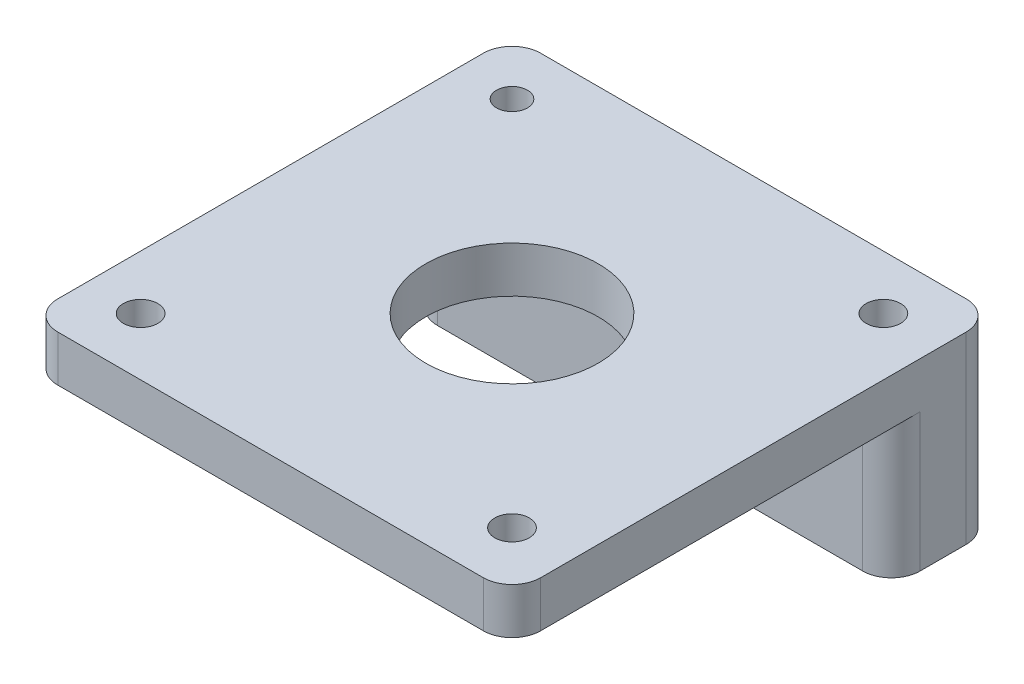
ISO-10303-21;
HEADER;
FILE_DESCRIPTION(('STEP AP214'),'2;1');
FILE_NAME('part.step','',(''),(''),'','','');
FILE_SCHEMA(('AUTOMOTIVE_DESIGN { 1 0 10303 214 1 1 1 1 }'));
ENDSEC;
DATA;
#1=APPLICATION_CONTEXT('core data for automotive mechanical design processes');
#2=APPLICATION_PROTOCOL_DEFINITION('international standard','automotive_design',2000,#1);
#3=PRODUCT_CONTEXT('',#1,'mechanical');
#4=PRODUCT('Part','Part','',(#3));
#5=PRODUCT_RELATED_PRODUCT_CATEGORY('part','',(#4));
#6=PRODUCT_DEFINITION_FORMATION('','',#4);
#7=PRODUCT_DEFINITION_CONTEXT('part definition',#1,'design');
#8=PRODUCT_DEFINITION('design','',#6,#7);
#9=PRODUCT_DEFINITION_SHAPE('','',#8);
#10=(LENGTH_UNIT() NAMED_UNIT(*) SI_UNIT(.MILLI.,.METRE.));
#11=(NAMED_UNIT(*) PLANE_ANGLE_UNIT() SI_UNIT($,.RADIAN.));
#12=(NAMED_UNIT(*) SI_UNIT($,.STERADIAN.) SOLID_ANGLE_UNIT());
#13=UNCERTAINTY_MEASURE_WITH_UNIT(LENGTH_MEASURE(1.E-05),#10,'distance_accuracy_value','');
#14=(GEOMETRIC_REPRESENTATION_CONTEXT(3) GLOBAL_UNCERTAINTY_ASSIGNED_CONTEXT((#13)) GLOBAL_UNIT_ASSIGNED_CONTEXT((#10,
#11,#12)) REPRESENTATION_CONTEXT('',''));
#15=CARTESIAN_POINT('',(0.,0.,0.));
#16=DIRECTION('',(0.,0.,1.));
#17=DIRECTION('',(1.,0.,0.));
#18=AXIS2_PLACEMENT_3D('',#15,#16,#17);
#19=CARTESIAN_POINT('',(37.,-4.,-4.29999999999951));
#20=DIRECTION('',(0.,1.,0.));
#21=DIRECTION('',(0.,0.,1.));
#22=AXIS2_PLACEMENT_3D('',#19,#20,#21);
#23=CYLINDRICAL_SURFACE('',#22,1.5);
#24=CARTESIAN_POINT('',(37.,16.,-4.29999999999951));
#25=DIRECTION('',(0.,1.,0.));
#26=DIRECTION('',(0.,0.,1.));
#27=AXIS2_PLACEMENT_3D('',#24,#25,#26);
#28=CIRCLE('',#27,1.5);
#29=CARTESIAN_POINT('',(37.,16.,-2.79999999999951));
#30=VERTEX_POINT('',#29);
#31=EDGE_CURVE('E230',#30,#30,#28,.T.);
#32=ORIENTED_EDGE('',*,*,#31,.T.);
#33=EDGE_LOOP('',(#32));
#34=FACE_BOUND('',#33,.T.);
#35=CARTESIAN_POINT('',(37.,5.,-4.29999999999951));
#36=DIRECTION('',(0.,-1.,0.));
#37=DIRECTION('',(0.,0.,-1.));
#38=AXIS2_PLACEMENT_3D('',#35,#36,#37);
#39=CIRCLE('',#38,1.5);
#40=CARTESIAN_POINT('',(37.,5.,-5.7999999999995));
#41=VERTEX_POINT('',#40);
#42=EDGE_CURVE('E37',#41,#41,#39,.F.);
#43=ORIENTED_EDGE('',*,*,#42,.F.);
#44=EDGE_LOOP('',(#43));
#45=FACE_BOUND('',#44,.T.);
#46=ADVANCED_FACE('F33',(#34,#45),#23,.F.);
#47=CARTESIAN_POINT('',(4.7,-4.,-4.29999999999994));
#48=DIRECTION('',(0.,1.,0.));
#49=DIRECTION('',(0.,0.,1.));
#50=AXIS2_PLACEMENT_3D('',#47,#48,#49);
#51=CYLINDRICAL_SURFACE('',#50,1.34225206482077);
#52=CARTESIAN_POINT('',(4.7,16.,-4.29999999999994));
#53=DIRECTION('',(0.,1.,0.));
#54=DIRECTION('',(0.,0.,1.));
#55=AXIS2_PLACEMENT_3D('',#52,#53,#54);
#56=CIRCLE('',#55,1.34225206482077);
#57=CARTESIAN_POINT('',(4.7,16.,-2.95774793517917));
#58=VERTEX_POINT('',#57);
#59=EDGE_CURVE('E225',#58,#58,#56,.T.);
#60=ORIENTED_EDGE('',*,*,#59,.T.);
#61=EDGE_LOOP('',(#60));
#62=FACE_BOUND('',#61,.T.);
#63=CARTESIAN_POINT('',(4.7,5.,-4.29999999999994));
#64=DIRECTION('',(0.,-1.,0.));
#65=DIRECTION('',(0.,0.,-1.));
#66=AXIS2_PLACEMENT_3D('',#63,#64,#65);
#67=CIRCLE('',#66,1.34225206482077);
#68=CARTESIAN_POINT('',(4.7,5.,-5.64225206482072));
#69=VERTEX_POINT('',#68);
#70=EDGE_CURVE('E223',#69,#69,#67,.F.);
#71=ORIENTED_EDGE('',*,*,#70,.F.);
#72=EDGE_LOOP('',(#71));
#73=FACE_BOUND('',#72,.T.);
#74=ADVANCED_FACE('F319',(#62,#73),#51,.F.);
#75=CARTESIAN_POINT('',(39.5,12.,-6.5));
#76=DIRECTION('',(0.,1.,0.));
#77=DIRECTION('',(0.,0.,1.));
#78=AXIS2_PLACEMENT_3D('',#75,#76,#77);
#79=CYLINDRICAL_SURFACE('',#78,2.5);
#80=DIRECTION('',(0.,1.,0.));
#81=VECTOR('',#80,1.);
#82=CARTESIAN_POINT('',(42.,12.,-6.5));
#83=LINE('',#82,#81);
#84=CARTESIAN_POINT('',(42.,0.,-6.5));
#85=VERTEX_POINT('',#84);
#86=CARTESIAN_POINT('',(42.,16.,-6.5));
#87=VERTEX_POINT('',#86);
#88=EDGE_CURVE('E217',#85,#87,#83,.T.);
#89=ORIENTED_EDGE('',*,*,#88,.F.);
#90=CARTESIAN_POINT('',(39.5,0.,-6.5));
#91=DIRECTION('',(0.,-1.,0.));
#92=DIRECTION('',(0.,0.,-1.));
#93=AXIS2_PLACEMENT_3D('',#90,#91,#92);
#94=CIRCLE('',#93,2.5);
#95=CARTESIAN_POINT('',(39.5,0.,-9.));
#96=VERTEX_POINT('',#95);
#97=EDGE_CURVE('E42',#96,#85,#94,.T.);
#98=ORIENTED_EDGE('',*,*,#97,.F.);
#99=DIRECTION('',(0.,1.,0.));
#100=VECTOR('',#99,1.);
#101=CARTESIAN_POINT('',(39.5,12.,-9.));
#102=LINE('',#101,#100);
#103=CARTESIAN_POINT('',(39.5,16.,-9.));
#104=VERTEX_POINT('',#103);
#105=EDGE_CURVE('E220',#104,#96,#102,.F.);
#106=ORIENTED_EDGE('',*,*,#105,.F.);
#107=CARTESIAN_POINT('',(39.5,16.,-6.5));
#108=DIRECTION('',(0.,1.,0.));
#109=DIRECTION('',(0.,0.,1.));
#110=AXIS2_PLACEMENT_3D('',#107,#108,#109);
#111=CIRCLE('',#110,2.5);
#112=EDGE_CURVE('E11',#87,#104,#111,.T.);
#113=ORIENTED_EDGE('',*,*,#112,.F.);
#114=EDGE_LOOP('',(#89,#98,#106,#113));
#115=FACE_BOUND('',#114,.T.);
#116=ADVANCED_FACE('F35',(#115),#79,.T.);
#117=CARTESIAN_POINT('',(39.5,12.,-2.5));
#118=DIRECTION('',(0.,1.,0.));
#119=DIRECTION('',(0.,0.,1.));
#120=AXIS2_PLACEMENT_3D('',#117,#118,#119);
#121=CYLINDRICAL_SURFACE('',#120,2.5);
#122=DIRECTION('',(0.,1.,0.));
#123=VECTOR('',#122,1.);
#124=CARTESIAN_POINT('',(39.5,12.,0.));
#125=LINE('',#124,#123);
#126=CARTESIAN_POINT('',(39.5,0.,0.));
#127=VERTEX_POINT('',#126);
#128=CARTESIAN_POINT('',(39.5,12.,0.));
#129=VERTEX_POINT('',#128);
#130=EDGE_CURVE('E206',#127,#129,#125,.T.);
#131=ORIENTED_EDGE('',*,*,#130,.F.);
#132=CARTESIAN_POINT('',(39.5,0.,-2.5));
#133=DIRECTION('',(0.,-1.,0.));
#134=DIRECTION('',(0.,0.,-1.));
#135=AXIS2_PLACEMENT_3D('',#132,#133,#134);
#136=CIRCLE('',#135,2.5);
#137=CARTESIAN_POINT('',(42.,0.,-2.5));
#138=VERTEX_POINT('',#137);
#139=EDGE_CURVE('E212',#138,#127,#136,.T.);
#140=ORIENTED_EDGE('',*,*,#139,.F.);
#141=DIRECTION('',(0.,1.,0.));
#142=VECTOR('',#141,1.);
#143=CARTESIAN_POINT('',(42.,12.,-2.5));
#144=LINE('',#143,#142);
#145=CARTESIAN_POINT('',(42.,12.,-2.5));
#146=VERTEX_POINT('',#145);
#147=EDGE_CURVE('E209',#146,#138,#144,.F.);
#148=ORIENTED_EDGE('',*,*,#147,.F.);
#149=CARTESIAN_POINT('',(39.5,12.,-2.5));
#150=DIRECTION('',(0.,1.,0.));
#151=DIRECTION('',(0.,0.,1.));
#152=AXIS2_PLACEMENT_3D('',#149,#150,#151);
#153=CIRCLE('',#152,2.5);
#154=EDGE_CURVE('E214',#146,#129,#153,.F.);
#155=ORIENTED_EDGE('',*,*,#154,.T.);
#156=EDGE_LOOP('',(#131,#140,#148,#155));
#157=FACE_BOUND('',#156,.T.);
#158=ADVANCED_FACE('F294',(#157),#121,.T.);
#159=CARTESIAN_POINT('',(39.5,16.,30.5));
#160=DIRECTION('',(0.,1.,0.));
#161=DIRECTION('',(0.,0.,1.));
#162=AXIS2_PLACEMENT_3D('',#159,#160,#161);
#163=CYLINDRICAL_SURFACE('',#162,2.5);
#164=DIRECTION('',(0.,1.,0.));
#165=VECTOR('',#164,1.);
#166=CARTESIAN_POINT('',(39.5,16.,33.));
#167=LINE('',#166,#165);
#168=CARTESIAN_POINT('',(39.5,12.,33.));
#169=VERTEX_POINT('',#168);
#170=CARTESIAN_POINT('',(39.5,16.,33.));
#171=VERTEX_POINT('',#170);
#172=EDGE_CURVE('E198',#169,#171,#167,.T.);
#173=ORIENTED_EDGE('',*,*,#172,.F.);
#174=CARTESIAN_POINT('',(39.5,12.,30.5));
#175=DIRECTION('',(0.,1.,0.));
#176=DIRECTION('',(0.,0.,1.));
#177=AXIS2_PLACEMENT_3D('',#174,#175,#176);
#178=CIRCLE('',#177,2.5);
#179=CARTESIAN_POINT('',(42.,12.,30.5));
#180=VERTEX_POINT('',#179);
#181=EDGE_CURVE('E149',#180,#169,#178,.F.);
#182=ORIENTED_EDGE('',*,*,#181,.F.);
#183=DIRECTION('',(0.,1.,0.));
#184=VECTOR('',#183,1.);
#185=CARTESIAN_POINT('',(42.,12.,30.5));
#186=LINE('',#185,#184);
#187=CARTESIAN_POINT('',(42.,16.,30.5));
#188=VERTEX_POINT('',#187);
#189=EDGE_CURVE('E200',#188,#180,#186,.F.);
#190=ORIENTED_EDGE('',*,*,#189,.F.);
#191=CARTESIAN_POINT('',(39.5,16.,30.5));
#192=DIRECTION('',(0.,1.,0.));
#193=DIRECTION('',(0.,0.,1.));
#194=AXIS2_PLACEMENT_3D('',#191,#192,#193);
#195=CIRCLE('',#194,2.5);
#196=EDGE_CURVE('E204',#171,#188,#195,.T.);
#197=ORIENTED_EDGE('',*,*,#196,.F.);
#198=EDGE_LOOP('',(#173,#182,#190,#197));
#199=FACE_BOUND('',#198,.T.);
#200=ADVANCED_FACE('F284',(#199),#163,.T.);
#201=CARTESIAN_POINT('',(2.5,12.,-2.5));
#202=DIRECTION('',(0.,-1.,0.));
#203=DIRECTION('',(0.,0.,-1.));
#204=AXIS2_PLACEMENT_3D('',#201,#202,#203);
#205=CYLINDRICAL_SURFACE('',#204,2.5);
#206=DIRECTION('',(0.,-1.,0.));
#207=VECTOR('',#206,1.);
#208=CARTESIAN_POINT('',(2.5,12.,0.));
#209=LINE('',#208,#207);
#210=CARTESIAN_POINT('',(2.5,12.,0.));
#211=VERTEX_POINT('',#210);
#212=CARTESIAN_POINT('',(2.5,0.,0.));
#213=VERTEX_POINT('',#212);
#214=EDGE_CURVE('E187',#211,#213,#209,.T.);
#215=ORIENTED_EDGE('',*,*,#214,.F.);
#216=CARTESIAN_POINT('',(2.5,12.,-2.5));
#217=DIRECTION('',(0.,1.,0.));
#218=DIRECTION('',(0.,0.,1.));
#219=AXIS2_PLACEMENT_3D('',#216,#217,#218);
#220=CIRCLE('',#219,2.5);
#221=CARTESIAN_POINT('',(0.,12.,-2.5));
#222=VERTEX_POINT('',#221);
#223=EDGE_CURVE('E195',#211,#222,#220,.F.);
#224=ORIENTED_EDGE('',*,*,#223,.T.);
#225=DIRECTION('',(0.,-1.,0.));
#226=VECTOR('',#225,1.);
#227=CARTESIAN_POINT('',(0.,12.,-2.5));
#228=LINE('',#227,#226);
#229=CARTESIAN_POINT('',(0.,0.,-2.5));
#230=VERTEX_POINT('',#229);
#231=EDGE_CURVE('E190',#230,#222,#228,.F.);
#232=ORIENTED_EDGE('',*,*,#231,.F.);
#233=CARTESIAN_POINT('',(2.5,0.,-2.5));
#234=DIRECTION('',(0.,-1.,0.));
#235=DIRECTION('',(0.,0.,-1.));
#236=AXIS2_PLACEMENT_3D('',#233,#234,#235);
#237=CIRCLE('',#236,2.5);
#238=EDGE_CURVE('E193',#213,#230,#237,.T.);
#239=ORIENTED_EDGE('',*,*,#238,.F.);
#240=EDGE_LOOP('',(#215,#224,#232,#239));
#241=FACE_BOUND('',#240,.T.);
#242=ADVANCED_FACE('F302',(#241),#205,.T.);
#243=CARTESIAN_POINT('',(2.5,12.,-6.5));
#244=DIRECTION('',(0.,-1.,0.));
#245=DIRECTION('',(0.,0.,-1.));
#246=AXIS2_PLACEMENT_3D('',#243,#244,#245);
#247=CYLINDRICAL_SURFACE('',#246,2.5);
#248=DIRECTION('',(0.,-1.,0.));
#249=VECTOR('',#248,1.);
#250=CARTESIAN_POINT('',(0.,12.,-6.5));
#251=LINE('',#250,#249);
#252=CARTESIAN_POINT('',(0.,16.,-6.5));
#253=VERTEX_POINT('',#252);
#254=CARTESIAN_POINT('',(0.,0.,-6.5));
#255=VERTEX_POINT('',#254);
#256=EDGE_CURVE('E135',#253,#255,#251,.T.);
#257=ORIENTED_EDGE('',*,*,#256,.F.);
#258=CARTESIAN_POINT('',(2.5,16.,-6.5));
#259=DIRECTION('',(0.,1.,0.));
#260=DIRECTION('',(0.,0.,1.));
#261=AXIS2_PLACEMENT_3D('',#258,#259,#260);
#262=CIRCLE('',#261,2.5);
#263=CARTESIAN_POINT('',(2.5,16.,-9.));
#264=VERTEX_POINT('',#263);
#265=EDGE_CURVE('E182',#264,#253,#262,.T.);
#266=ORIENTED_EDGE('',*,*,#265,.F.);
#267=DIRECTION('',(0.,-1.,0.));
#268=VECTOR('',#267,1.);
#269=CARTESIAN_POINT('',(2.5,12.,-9.));
#270=LINE('',#269,#268);
#271=CARTESIAN_POINT('',(2.5,0.,-9.));
#272=VERTEX_POINT('',#271);
#273=EDGE_CURVE('E179',#272,#264,#270,.F.);
#274=ORIENTED_EDGE('',*,*,#273,.F.);
#275=CARTESIAN_POINT('',(2.5,0.,-6.5));
#276=DIRECTION('',(0.,-1.,0.));
#277=DIRECTION('',(0.,0.,-1.));
#278=AXIS2_PLACEMENT_3D('',#275,#276,#277);
#279=CIRCLE('',#278,2.5);
#280=EDGE_CURVE('E184',#255,#272,#279,.T.);
#281=ORIENTED_EDGE('',*,*,#280,.F.);
#282=EDGE_LOOP('',(#257,#266,#274,#281));
#283=FACE_BOUND('',#282,.T.);
#284=ADVANCED_FACE('F272',(#283),#247,.T.);
#285=CARTESIAN_POINT('',(2.5,16.,30.5));
#286=DIRECTION('',(0.,-1.,0.));
#287=DIRECTION('',(0.,0.,-1.));
#288=AXIS2_PLACEMENT_3D('',#285,#286,#287);
#289=CYLINDRICAL_SURFACE('',#288,2.5);
#290=DIRECTION('',(0.,-1.,0.));
#291=VECTOR('',#290,1.);
#292=CARTESIAN_POINT('',(2.5,16.,33.));
#293=LINE('',#292,#291);
#294=CARTESIAN_POINT('',(2.5,16.,33.));
#295=VERTEX_POINT('',#294);
#296=CARTESIAN_POINT('',(2.5,12.,33.));
#297=VERTEX_POINT('',#296);
#298=EDGE_CURVE('E128',#295,#297,#293,.T.);
#299=ORIENTED_EDGE('',*,*,#298,.F.);
#300=CARTESIAN_POINT('',(2.5,16.,30.5));
#301=DIRECTION('',(0.,1.,0.));
#302=DIRECTION('',(0.,0.,1.));
#303=AXIS2_PLACEMENT_3D('',#300,#301,#302);
#304=CIRCLE('',#303,2.5);
#305=CARTESIAN_POINT('',(0.,16.,30.5));
#306=VERTEX_POINT('',#305);
#307=EDGE_CURVE('E136',#306,#295,#304,.T.);
#308=ORIENTED_EDGE('',*,*,#307,.F.);
#309=DIRECTION('',(0.,-1.,0.));
#310=VECTOR('',#309,1.);
#311=CARTESIAN_POINT('',(0.,12.,30.5));
#312=LINE('',#311,#310);
#313=CARTESIAN_POINT('',(0.,12.,30.5));
#314=VERTEX_POINT('',#313);
#315=EDGE_CURVE('E131',#314,#306,#312,.F.);
#316=ORIENTED_EDGE('',*,*,#315,.F.);
#317=CARTESIAN_POINT('',(2.5,12.,30.5));
#318=DIRECTION('',(0.,1.,0.));
#319=DIRECTION('',(0.,0.,1.));
#320=AXIS2_PLACEMENT_3D('',#317,#318,#319);
#321=CIRCLE('',#320,2.5);
#322=EDGE_CURVE('E124',#297,#314,#321,.F.);
#323=ORIENTED_EDGE('',*,*,#322,.F.);
#324=EDGE_LOOP('',(#299,#308,#316,#323));
#325=FACE_BOUND('',#324,.T.);
#326=ADVANCED_FACE('F126',(#325),#289,.T.);
#327=CARTESIAN_POINT('',(0.,12.,0.));
#328=DIRECTION('',(1.,0.,0.));
#329=DIRECTION('',(0.,0.,-1.));
#330=AXIS2_PLACEMENT_3D('',#327,#328,#329);
#331=PLANE('',#330);
#332=DIRECTION('',(0.,0.,1.));
#333=VECTOR('',#332,1.);
#334=CARTESIAN_POINT('',(0.,0.,0.));
#335=LINE('',#334,#333);
#336=EDGE_CURVE('E163',#255,#230,#335,.T.);
#337=ORIENTED_EDGE('',*,*,#336,.T.);
#338=ORIENTED_EDGE('',*,*,#231,.T.);
#339=DIRECTION('',(0.,0.,1.));
#340=VECTOR('',#339,1.);
#341=CARTESIAN_POINT('',(0.,12.,-9.));
#342=LINE('',#341,#340);
#343=EDGE_CURVE('E152',#222,#314,#342,.T.);
#344=ORIENTED_EDGE('',*,*,#343,.T.);
#345=ORIENTED_EDGE('',*,*,#315,.T.);
#346=DIRECTION('',(0.,0.,1.));
#347=VECTOR('',#346,1.);
#348=CARTESIAN_POINT('',(0.,16.,-9.));
#349=LINE('',#348,#347);
#350=EDGE_CURVE('E154',#253,#306,#349,.T.);
#351=ORIENTED_EDGE('',*,*,#350,.F.);
#352=ORIENTED_EDGE('',*,*,#256,.T.);
#353=EDGE_LOOP('',(#337,#338,#344,#345,#351,#352));
#354=FACE_BOUND('',#353,.T.);
#355=ADVANCED_FACE('F280',(#354),#331,.F.);
#356=CARTESIAN_POINT('',(0.,12.,0.));
#357=DIRECTION('',(0.,0.,-1.));
#358=DIRECTION('',(-1.,0.,0.));
#359=AXIS2_PLACEMENT_3D('',#356,#357,#358);
#360=PLANE('',#359);
#361=DIRECTION('',(1.,0.,0.));
#362=VECTOR('',#361,1.);
#363=CARTESIAN_POINT('',(0.,12.,0.));
#364=LINE('',#363,#362);
#365=CARTESIAN_POINT('',(27.,12.,0.));
#366=VERTEX_POINT('',#365);
#367=EDGE_CURVE('E162',#366,#129,#364,.T.);
#368=ORIENTED_EDGE('',*,*,#367,.F.);
#369=CARTESIAN_POINT('',(27.,8.,0.));
#370=DIRECTION('',(0.,0.,-1.));
#371=DIRECTION('',(-1.,0.,0.));
#372=AXIS2_PLACEMENT_3D('',#369,#370,#371);
#373=CIRCLE('',#372,4.);
#374=EDGE_CURVE('E48',#366,#366,#373,.T.);
#375=ORIENTED_EDGE('',*,*,#374,.T.);
#376=EDGE_CURVE('E145',#211,#366,#364,.T.);
#377=ORIENTED_EDGE('',*,*,#376,.F.);
#378=ORIENTED_EDGE('',*,*,#214,.T.);
#379=DIRECTION('',(1.,0.,0.));
#380=VECTOR('',#379,1.);
#381=CARTESIAN_POINT('',(0.,0.,0.));
#382=LINE('',#381,#380);
#383=EDGE_CURVE('E166',#213,#127,#382,.T.);
#384=ORIENTED_EDGE('',*,*,#383,.T.);
#385=ORIENTED_EDGE('',*,*,#130,.T.);
#386=EDGE_LOOP('',(#368,#375,#377,#378,#384,#385));
#387=FACE_BOUND('',#386,.T.);
#388=ADVANCED_FACE('F298',(#387),#360,.F.);
#389=CARTESIAN_POINT('',(42.,12.,0.));
#390=DIRECTION('',(-1.,0.,0.));
#391=DIRECTION('',(0.,0.,1.));
#392=AXIS2_PLACEMENT_3D('',#389,#390,#391);
#393=PLANE('',#392);
#394=DIRECTION('',(0.,0.,-1.));
#395=VECTOR('',#394,1.);
#396=CARTESIAN_POINT('',(42.,0.,0.));
#397=LINE('',#396,#395);
#398=EDGE_CURVE('E170',#138,#85,#397,.T.);
#399=ORIENTED_EDGE('',*,*,#398,.T.);
#400=ORIENTED_EDGE('',*,*,#88,.T.);
#401=DIRECTION('',(0.,0.,-1.));
#402=VECTOR('',#401,1.);
#403=CARTESIAN_POINT('',(42.,16.,-9.));
#404=LINE('',#403,#402);
#405=EDGE_CURVE('E264',#188,#87,#404,.T.);
#406=ORIENTED_EDGE('',*,*,#405,.F.);
#407=ORIENTED_EDGE('',*,*,#189,.T.);
#408=DIRECTION('',(0.,0.,-1.));
#409=VECTOR('',#408,1.);
#410=CARTESIAN_POINT('',(42.,12.,-9.));
#411=LINE('',#410,#409);
#412=EDGE_CURVE('E151',#180,#146,#411,.T.);
#413=ORIENTED_EDGE('',*,*,#412,.T.);
#414=ORIENTED_EDGE('',*,*,#147,.T.);
#415=EDGE_LOOP('',(#399,#400,#406,#407,#413,#414));
#416=FACE_BOUND('',#415,.T.);
#417=ADVANCED_FACE('F286',(#416),#393,.F.);
#418=CARTESIAN_POINT('',(0.,12.,-9.));
#419=DIRECTION('',(0.,0.,1.));
#420=DIRECTION('',(1.,0.,0.));
#421=AXIS2_PLACEMENT_3D('',#418,#419,#420);
#422=PLANE('',#421);
#423=CARTESIAN_POINT('',(27.,8.,-9.));
#424=DIRECTION('',(0.,0.,-1.));
#425=DIRECTION('',(-1.,0.,0.));
#426=AXIS2_PLACEMENT_3D('',#423,#424,#425);
#427=CIRCLE('',#426,4.);
#428=CARTESIAN_POINT('',(23.,8.,-9.));
#429=VERTEX_POINT('',#428);
#430=EDGE_CURVE('E304',#429,#429,#427,.T.);
#431=ORIENTED_EDGE('',*,*,#430,.F.);
#432=EDGE_LOOP('',(#431));
#433=FACE_BOUND('',#432,.T.);
#434=DIRECTION('',(-1.,0.,0.));
#435=VECTOR('',#434,1.);
#436=CARTESIAN_POINT('',(0.,16.,-9.));
#437=LINE('',#436,#435);
#438=EDGE_CURVE('E167',#104,#264,#437,.T.);
#439=ORIENTED_EDGE('',*,*,#438,.F.);
#440=ORIENTED_EDGE('',*,*,#105,.T.);
#441=DIRECTION('',(-1.,0.,0.));
#442=VECTOR('',#441,1.);
#443=CARTESIAN_POINT('',(0.,0.,-9.));
#444=LINE('',#443,#442);
#445=EDGE_CURVE('E173',#96,#272,#444,.T.);
#446=ORIENTED_EDGE('',*,*,#445,.T.);
#447=ORIENTED_EDGE('',*,*,#273,.T.);
#448=EDGE_LOOP('',(#439,#440,#446,#447));
#449=FACE_BOUND('',#448,.T.);
#450=ADVANCED_FACE('F274',(#433,#449),#422,.F.);
#451=CARTESIAN_POINT('',(0.,0.,0.));
#452=DIRECTION('',(0.,-1.,0.));
#453=DIRECTION('',(0.,0.,-1.));
#454=AXIS2_PLACEMENT_3D('',#451,#452,#453);
#455=PLANE('',#454);
#456=CARTESIAN_POINT('',(37.,0.,-4.29999999999951));
#457=DIRECTION('',(0.,-1.,0.));
#458=DIRECTION('',(0.,0.,-1.));
#459=AXIS2_PLACEMENT_3D('',#456,#457,#458);
#460=CIRCLE('',#459,3.);
#461=CARTESIAN_POINT('',(37.,0.,-7.29999999999951));
#462=VERTEX_POINT('',#461);
#463=EDGE_CURVE('E240',#462,#462,#460,.T.);
#464=ORIENTED_EDGE('',*,*,#463,.F.);
#465=EDGE_LOOP('',(#464));
#466=FACE_BOUND('',#465,.T.);
#467=CARTESIAN_POINT('',(4.7,0.,-4.29999999999994));
#468=DIRECTION('',(0.,-1.,0.));
#469=DIRECTION('',(0.,0.,-1.));
#470=AXIS2_PLACEMENT_3D('',#467,#468,#469);
#471=CIRCLE('',#470,3.);
#472=CARTESIAN_POINT('',(4.7,0.,-7.29999999999995));
#473=VERTEX_POINT('',#472);
#474=EDGE_CURVE('E233',#473,#473,#471,.T.);
#475=ORIENTED_EDGE('',*,*,#474,.F.);
#476=EDGE_LOOP('',(#475));
#477=FACE_BOUND('',#476,.T.);
#478=ORIENTED_EDGE('',*,*,#445,.F.);
#479=ORIENTED_EDGE('',*,*,#97,.T.);
#480=ORIENTED_EDGE('',*,*,#398,.F.);
#481=ORIENTED_EDGE('',*,*,#139,.T.);
#482=ORIENTED_EDGE('',*,*,#383,.F.);
#483=ORIENTED_EDGE('',*,*,#238,.T.);
#484=ORIENTED_EDGE('',*,*,#336,.F.);
#485=ORIENTED_EDGE('',*,*,#280,.T.);
#486=EDGE_LOOP('',(#478,#479,#480,#481,#482,#483,#484,#485));
#487=FACE_BOUND('',#486,.T.);
#488=ADVANCED_FACE('F278',(#466,#477,#487),#455,.T.);
#489=CARTESIAN_POINT('',(0.,12.,0.));
#490=DIRECTION('',(0.,1.,0.));
#491=DIRECTION('',(0.,0.,1.));
#492=AXIS2_PLACEMENT_3D('',#489,#490,#491);
#493=PLANE('',#492);
#494=CARTESIAN_POINT('',(4.69999999999954,12.,28.));
#495=DIRECTION('',(0.,1.,0.));
#496=DIRECTION('',(0.,0.,1.));
#497=AXIS2_PLACEMENT_3D('',#494,#495,#496);
#498=CIRCLE('',#497,1.5);
#499=CARTESIAN_POINT('',(4.69999999999954,12.,29.5));
#500=VERTEX_POINT('',#499);
#501=EDGE_CURVE('E254',#500,#500,#498,.T.);
#502=ORIENTED_EDGE('',*,*,#501,.T.);
#503=EDGE_LOOP('',(#502));
#504=FACE_BOUND('',#503,.T.);
#505=CARTESIAN_POINT('',(36.9999999999995,12.,28.0000000000003));
#506=DIRECTION('',(0.,1.,0.));
#507=DIRECTION('',(0.,0.,1.));
#508=AXIS2_PLACEMENT_3D('',#505,#506,#507);
#509=CIRCLE('',#508,1.5);
#510=CARTESIAN_POINT('',(36.9999999999995,12.,29.5000000000003));
#511=VERTEX_POINT('',#510);
#512=EDGE_CURVE('E246',#511,#511,#509,.T.);
#513=ORIENTED_EDGE('',*,*,#512,.T.);
#514=EDGE_LOOP('',(#513));
#515=FACE_BOUND('',#514,.T.);
#516=CARTESIAN_POINT('',(20.8499999999994,12.,11.8499999999999));
#517=DIRECTION('',(0.,1.,0.));
#518=DIRECTION('',(0.,0.,1.));
#519=AXIS2_PLACEMENT_3D('',#516,#517,#518);
#520=CIRCLE('',#519,7.5);
#521=CARTESIAN_POINT('',(20.8499999999994,12.,19.3499999999999));
#522=VERTEX_POINT('',#521);
#523=EDGE_CURVE('E156',#522,#522,#520,.T.);
#524=ORIENTED_EDGE('',*,*,#523,.T.);
#525=EDGE_LOOP('',(#524));
#526=FACE_BOUND('',#525,.T.);
#527=ORIENTED_EDGE('',*,*,#412,.F.);
#528=ORIENTED_EDGE('',*,*,#181,.T.);
#529=DIRECTION('',(1.,0.,0.));
#530=VECTOR('',#529,1.);
#531=CARTESIAN_POINT('',(0.,12.,33.));
#532=LINE('',#531,#530);
#533=EDGE_CURVE('E142',#297,#169,#532,.T.);
#534=ORIENTED_EDGE('',*,*,#533,.F.);
#535=ORIENTED_EDGE('',*,*,#322,.T.);
#536=ORIENTED_EDGE('',*,*,#343,.F.);
#537=ORIENTED_EDGE('',*,*,#223,.F.);
#538=ORIENTED_EDGE('',*,*,#376,.T.);
#539=ORIENTED_EDGE('',*,*,#367,.T.);
#540=ORIENTED_EDGE('',*,*,#154,.F.);
#541=EDGE_LOOP('',(#527,#528,#534,#535,#536,#537,#538,#539,#540));
#542=FACE_BOUND('',#541,.T.);
#543=ADVANCED_FACE('F148',(#504,#515,#526,#542),#493,.F.);
#544=CARTESIAN_POINT('',(0.,16.,33.));
#545=DIRECTION('',(0.,0.,-1.));
#546=DIRECTION('',(-1.,0.,0.));
#547=AXIS2_PLACEMENT_3D('',#544,#545,#546);
#548=PLANE('',#547);
#549=ORIENTED_EDGE('',*,*,#533,.T.);
#550=ORIENTED_EDGE('',*,*,#172,.T.);
#551=DIRECTION('',(1.,0.,0.));
#552=VECTOR('',#551,1.);
#553=CARTESIAN_POINT('',(0.,16.,33.));
#554=LINE('',#553,#552);
#555=EDGE_CURVE('E144',#295,#171,#554,.T.);
#556=ORIENTED_EDGE('',*,*,#555,.F.);
#557=ORIENTED_EDGE('',*,*,#298,.T.);
#558=EDGE_LOOP('',(#549,#550,#556,#557));
#559=FACE_BOUND('',#558,.T.);
#560=ADVANCED_FACE('F140',(#559),#548,.F.);
#561=CARTESIAN_POINT('',(0.,16.,0.));
#562=DIRECTION('',(0.,1.,0.));
#563=DIRECTION('',(0.,0.,1.));
#564=AXIS2_PLACEMENT_3D('',#561,#562,#563);
#565=PLANE('',#564);
#566=CARTESIAN_POINT('',(4.69999999999954,16.,28.));
#567=DIRECTION('',(0.,1.,0.));
#568=DIRECTION('',(0.,0.,1.));
#569=AXIS2_PLACEMENT_3D('',#566,#567,#568);
#570=CIRCLE('',#569,1.5);
#571=CARTESIAN_POINT('',(4.69999999999954,16.,29.5));
#572=VERTEX_POINT('',#571);
#573=EDGE_CURVE('E243',#572,#572,#570,.T.);
#574=ORIENTED_EDGE('',*,*,#573,.F.);
#575=EDGE_LOOP('',(#574));
#576=FACE_BOUND('',#575,.T.);
#577=CARTESIAN_POINT('',(36.9999999999995,16.,28.0000000000003));
#578=DIRECTION('',(0.,1.,0.));
#579=DIRECTION('',(0.,0.,1.));
#580=AXIS2_PLACEMENT_3D('',#577,#578,#579);
#581=CIRCLE('',#580,1.5);
#582=CARTESIAN_POINT('',(36.9999999999995,16.,29.5000000000003));
#583=VERTEX_POINT('',#582);
#584=EDGE_CURVE('E247',#583,#583,#581,.T.);
#585=ORIENTED_EDGE('',*,*,#584,.F.);
#586=EDGE_LOOP('',(#585));
#587=FACE_BOUND('',#586,.T.);
#588=ORIENTED_EDGE('',*,*,#31,.F.);
#589=EDGE_LOOP('',(#588));
#590=FACE_BOUND('',#589,.T.);
#591=ORIENTED_EDGE('',*,*,#59,.F.);
#592=EDGE_LOOP('',(#591));
#593=FACE_BOUND('',#592,.T.);
#594=CARTESIAN_POINT('',(20.8499999999994,16.,11.8499999999999));
#595=DIRECTION('',(0.,1.,0.));
#596=DIRECTION('',(0.,0.,1.));
#597=AXIS2_PLACEMENT_3D('',#594,#595,#596);
#598=CIRCLE('',#597,7.5);
#599=CARTESIAN_POINT('',(20.8499999999994,16.,19.3499999999999));
#600=VERTEX_POINT('',#599);
#601=EDGE_CURVE('E257',#600,#600,#598,.T.);
#602=ORIENTED_EDGE('',*,*,#601,.F.);
#603=EDGE_LOOP('',(#602));
#604=FACE_BOUND('',#603,.T.);
#605=ORIENTED_EDGE('',*,*,#405,.T.);
#606=ORIENTED_EDGE('',*,*,#112,.T.);
#607=ORIENTED_EDGE('',*,*,#438,.T.);
#608=ORIENTED_EDGE('',*,*,#265,.T.);
#609=ORIENTED_EDGE('',*,*,#350,.T.);
#610=ORIENTED_EDGE('',*,*,#307,.T.);
#611=ORIENTED_EDGE('',*,*,#555,.T.);
#612=ORIENTED_EDGE('',*,*,#196,.T.);
#613=EDGE_LOOP('',(#605,#606,#607,#608,#609,#610,#611,#612));
#614=FACE_BOUND('',#613,.T.);
#615=ADVANCED_FACE('F267',(#576,#587,#590,#593,#604,#614),#565,.T.);
#616=CARTESIAN_POINT('',(20.8499999999994,-4.,11.8499999999999));
#617=DIRECTION('',(0.,1.,0.));
#618=DIRECTION('',(0.,0.,1.));
#619=AXIS2_PLACEMENT_3D('',#616,#617,#618);
#620=CYLINDRICAL_SURFACE('',#619,7.5);
#621=ORIENTED_EDGE('',*,*,#601,.T.);
#622=EDGE_LOOP('',(#621));
#623=FACE_BOUND('',#622,.T.);
#624=ORIENTED_EDGE('',*,*,#523,.F.);
#625=EDGE_LOOP('',(#624));
#626=FACE_BOUND('',#625,.T.);
#627=ADVANCED_FACE('F331',(#623,#626),#620,.F.);
#628=CARTESIAN_POINT('',(36.9999999999995,-4.,28.0000000000003));
#629=DIRECTION('',(0.,1.,0.));
#630=DIRECTION('',(0.,0.,1.));
#631=AXIS2_PLACEMENT_3D('',#628,#629,#630);
#632=CYLINDRICAL_SURFACE('',#631,1.5);
#633=ORIENTED_EDGE('',*,*,#584,.T.);
#634=EDGE_LOOP('',(#633));
#635=FACE_BOUND('',#634,.T.);
#636=ORIENTED_EDGE('',*,*,#512,.F.);
#637=EDGE_LOOP('',(#636));
#638=FACE_BOUND('',#637,.T.);
#639=ADVANCED_FACE('F328',(#635,#638),#632,.F.);
#640=CARTESIAN_POINT('',(4.69999999999954,-4.,28.));
#641=DIRECTION('',(0.,1.,0.));
#642=DIRECTION('',(0.,0.,1.));
#643=AXIS2_PLACEMENT_3D('',#640,#641,#642);
#644=CYLINDRICAL_SURFACE('',#643,1.5);
#645=ORIENTED_EDGE('',*,*,#573,.T.);
#646=EDGE_LOOP('',(#645));
#647=FACE_BOUND('',#646,.T.);
#648=ORIENTED_EDGE('',*,*,#501,.F.);
#649=EDGE_LOOP('',(#648));
#650=FACE_BOUND('',#649,.T.);
#651=ADVANCED_FACE('F396',(#647,#650),#644,.F.);
#652=CARTESIAN_POINT('',(4.7,5.,-4.29999999999994));
#653=DIRECTION('',(0.,-1.,0.));
#654=DIRECTION('',(0.,0.,-1.));
#655=AXIS2_PLACEMENT_3D('',#652,#653,#654);
#656=PLANE('',#655);
#657=CARTESIAN_POINT('',(4.7,5.,-4.29999999999994));
#658=DIRECTION('',(0.,-1.,0.));
#659=DIRECTION('',(0.,0.,-1.));
#660=AXIS2_PLACEMENT_3D('',#657,#658,#659);
#661=CIRCLE('',#660,3.);
#662=CARTESIAN_POINT('',(4.7,5.,-7.29999999999995));
#663=VERTEX_POINT('',#662);
#664=EDGE_CURVE('E226',#663,#663,#661,.T.);
#665=ORIENTED_EDGE('',*,*,#664,.T.);
#666=EDGE_LOOP('',(#665));
#667=FACE_BOUND('',#666,.T.);
#668=ORIENTED_EDGE('',*,*,#70,.T.);
#669=EDGE_LOOP('',(#668));
#670=FACE_BOUND('',#669,.T.);
#671=ADVANCED_FACE('F390',(#667,#670),#656,.T.);
#672=CARTESIAN_POINT('',(4.7,5.,-4.29999999999994));
#673=DIRECTION('',(0.,-1.,0.));
#674=DIRECTION('',(0.,0.,-1.));
#675=AXIS2_PLACEMENT_3D('',#672,#673,#674);
#676=CYLINDRICAL_SURFACE('',#675,3.);
#677=ORIENTED_EDGE('',*,*,#664,.F.);
#678=EDGE_LOOP('',(#677));
#679=FACE_BOUND('',#678,.T.);
#680=ORIENTED_EDGE('',*,*,#474,.T.);
#681=EDGE_LOOP('',(#680));
#682=FACE_BOUND('',#681,.T.);
#683=ADVANCED_FACE('F395',(#679,#682),#676,.F.);
#684=CARTESIAN_POINT('',(37.,5.,-4.29999999999951));
#685=DIRECTION('',(0.,-1.,0.));
#686=DIRECTION('',(0.,0.,-1.));
#687=AXIS2_PLACEMENT_3D('',#684,#685,#686);
#688=PLANE('',#687);
#689=CARTESIAN_POINT('',(37.,5.,-4.29999999999951));
#690=DIRECTION('',(0.,-1.,0.));
#691=DIRECTION('',(0.,0.,-1.));
#692=AXIS2_PLACEMENT_3D('',#689,#690,#691);
#693=CIRCLE('',#692,3.);
#694=CARTESIAN_POINT('',(37.,5.,-7.29999999999951));
#695=VERTEX_POINT('',#694);
#696=EDGE_CURVE('E307',#695,#695,#693,.T.);
#697=ORIENTED_EDGE('',*,*,#696,.T.);
#698=EDGE_LOOP('',(#697));
#699=FACE_BOUND('',#698,.T.);
#700=ORIENTED_EDGE('',*,*,#42,.T.);
#701=EDGE_LOOP('',(#700));
#702=FACE_BOUND('',#701,.T.);
#703=ADVANCED_FACE('F316',(#699,#702),#688,.T.);
#704=CARTESIAN_POINT('',(37.,5.,-4.29999999999951));
#705=DIRECTION('',(0.,-1.,0.));
#706=DIRECTION('',(0.,0.,-1.));
#707=AXIS2_PLACEMENT_3D('',#704,#705,#706);
#708=CYLINDRICAL_SURFACE('',#707,3.);
#709=ORIENTED_EDGE('',*,*,#696,.F.);
#710=EDGE_LOOP('',(#709));
#711=FACE_BOUND('',#710,.T.);
#712=ORIENTED_EDGE('',*,*,#463,.T.);
#713=EDGE_LOOP('',(#712));
#714=FACE_BOUND('',#713,.T.);
#715=ADVANCED_FACE('F415',(#711,#714),#708,.F.);
#716=CARTESIAN_POINT('',(27.,8.,0.));
#717=DIRECTION('',(0.,0.,-1.));
#718=DIRECTION('',(-1.,0.,0.));
#719=AXIS2_PLACEMENT_3D('',#716,#717,#718);
#720=CYLINDRICAL_SURFACE('',#719,4.);
#721=ORIENTED_EDGE('',*,*,#374,.F.);
#722=EDGE_LOOP('',(#721));
#723=FACE_BOUND('',#722,.T.);
#724=ORIENTED_EDGE('',*,*,#430,.T.);
#725=EDGE_LOOP('',(#724));
#726=FACE_BOUND('',#725,.T.);
#727=ADVANCED_FACE('F424',(#723,#726),#720,.F.);
#728=CLOSED_SHELL('',(#46,#74,#116,#158,#200,#242,#284,#326,#355,#388,#417,#450,#488,#543,#560,
#615,#627,#639,#651,#671,#683,#703,#715,#727));
#729=MANIFOLD_SOLID_BREP('B2',#728);
#730=ADVANCED_BREP_SHAPE_REPRESENTATION('',(#18,#729),#14);
#731=SHAPE_DEFINITION_REPRESENTATION(#9,#730);
ENDSEC;
END-ISO-10303-21;
